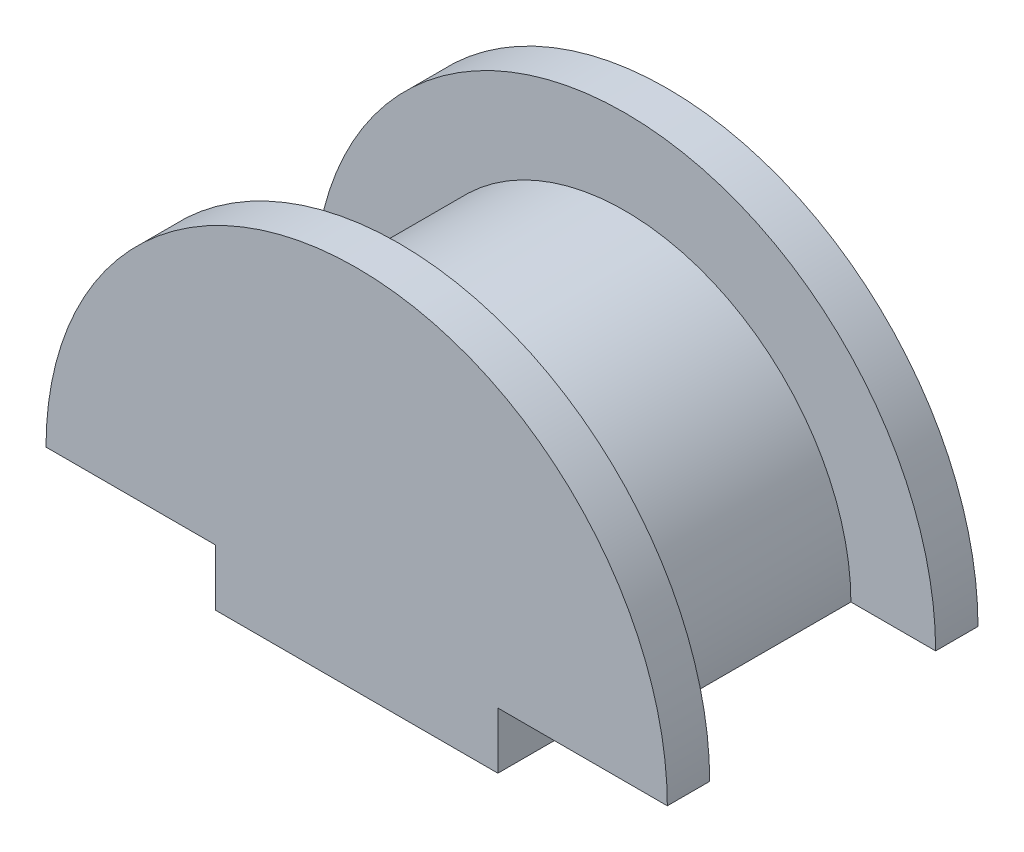
ISO-10303-21;
HEADER;
FILE_DESCRIPTION(('STEP AP214'),'2;1');
FILE_NAME('part.step','',(''),(''),'','','');
FILE_SCHEMA(('AUTOMOTIVE_DESIGN { 1 0 10303 214 1 1 1 1 }'));
ENDSEC;
DATA;
#1=APPLICATION_CONTEXT('core data for automotive mechanical design processes');
#2=APPLICATION_PROTOCOL_DEFINITION('international standard','automotive_design',2000,#1);
#3=PRODUCT_CONTEXT('',#1,'mechanical');
#4=PRODUCT('Part','Part','',(#3));
#5=PRODUCT_RELATED_PRODUCT_CATEGORY('part','',(#4));
#6=PRODUCT_DEFINITION_FORMATION('','',#4);
#7=PRODUCT_DEFINITION_CONTEXT('part definition',#1,'design');
#8=PRODUCT_DEFINITION('design','',#6,#7);
#9=PRODUCT_DEFINITION_SHAPE('','',#8);
#10=(LENGTH_UNIT() NAMED_UNIT(*) SI_UNIT(.MILLI.,.METRE.));
#11=(NAMED_UNIT(*) PLANE_ANGLE_UNIT() SI_UNIT($,.RADIAN.));
#12=(NAMED_UNIT(*) SI_UNIT($,.STERADIAN.) SOLID_ANGLE_UNIT());
#13=UNCERTAINTY_MEASURE_WITH_UNIT(LENGTH_MEASURE(1.E-05),#10,'distance_accuracy_value','');
#14=(GEOMETRIC_REPRESENTATION_CONTEXT(3) GLOBAL_UNCERTAINTY_ASSIGNED_CONTEXT((#13)) GLOBAL_UNIT_ASSIGNED_CONTEXT((#10,
#11,#12)) REPRESENTATION_CONTEXT('',''));
#15=CARTESIAN_POINT('',(0.,0.,0.));
#16=DIRECTION('',(0.,0.,1.));
#17=DIRECTION('',(1.,0.,0.));
#18=AXIS2_PLACEMENT_3D('',#15,#16,#17);
#19=CARTESIAN_POINT('',(0.,-2.,4.));
#20=DIRECTION('',(0.,-1.,0.));
#21=DIRECTION('',(0.,0.,-1.));
#22=AXIS2_PLACEMENT_3D('',#19,#20,#21);
#23=PLANE('',#22);
#24=CARTESIAN_POINT('',(0.,-2.,0.));
#25=DIRECTION('',(0.,-1.,0.));
#26=DIRECTION('',(0.,0.,-1.));
#27=AXIS2_PLACEMENT_3D('',#24,#25,#26);
#28=CIRCLE('',#27,3.);
#29=CARTESIAN_POINT('',(0.,-2.,-3.));
#30=VERTEX_POINT('',#29);
#31=EDGE_CURVE('E207',#30,#30,#28,.T.);
#32=ORIENTED_EDGE('',*,*,#31,.F.);
#33=EDGE_LOOP('',(#32));
#34=FACE_BOUND('',#33,.T.);
#35=DIRECTION('',(0.,0.,-1.));
#36=VECTOR('',#35,1.);
#37=CARTESIAN_POINT('',(-5.,-2.,4.));
#38=LINE('',#37,#36);
#39=CARTESIAN_POINT('',(-5.,-2.,5.5));
#40=VERTEX_POINT('',#39);
#41=CARTESIAN_POINT('',(-5.,-2.,-5.5));
#42=VERTEX_POINT('',#41);
#43=EDGE_CURVE('E220',#40,#42,#38,.T.);
#44=ORIENTED_EDGE('',*,*,#43,.T.);
#45=DIRECTION('',(1.,0.,0.));
#46=VECTOR('',#45,1.);
#47=CARTESIAN_POINT('',(0.,-2.,-5.5));
#48=LINE('',#47,#46);
#49=CARTESIAN_POINT('',(5.,-2.,-5.5));
#50=VERTEX_POINT('',#49);
#51=EDGE_CURVE('E139',#42,#50,#48,.T.);
#52=ORIENTED_EDGE('',*,*,#51,.T.);
#53=DIRECTION('',(0.,0.,-1.));
#54=VECTOR('',#53,1.);
#55=CARTESIAN_POINT('',(5.,-2.,4.));
#56=LINE('',#55,#54);
#57=CARTESIAN_POINT('',(5.,-2.,5.5));
#58=VERTEX_POINT('',#57);
#59=EDGE_CURVE('E11',#58,#50,#56,.T.);
#60=ORIENTED_EDGE('',*,*,#59,.F.);
#61=DIRECTION('',(1.,0.,0.));
#62=VECTOR('',#61,1.);
#63=CARTESIAN_POINT('',(0.,-2.,5.5));
#64=LINE('',#63,#62);
#65=EDGE_CURVE('E184',#40,#58,#64,.T.);
#66=ORIENTED_EDGE('',*,*,#65,.F.);
#67=EDGE_LOOP('',(#44,#52,#60,#66));
#68=FACE_BOUND('',#67,.T.);
#69=ADVANCED_FACE('F41',(#34,#68),#23,.T.);
#70=CARTESIAN_POINT('',(5.,0.,4.));
#71=DIRECTION('',(1.,0.,0.));
#72=DIRECTION('',(0.,0.,-1.));
#73=AXIS2_PLACEMENT_3D('',#70,#71,#72);
#74=PLANE('',#73);
#75=ORIENTED_EDGE('',*,*,#59,.T.);
#76=DIRECTION('',(0.,1.,0.));
#77=VECTOR('',#76,1.);
#78=CARTESIAN_POINT('',(5.,0.,-5.5));
#79=LINE('',#78,#77);
#80=CARTESIAN_POINT('',(5.,0.,-5.5));
#81=VERTEX_POINT('',#80);
#82=EDGE_CURVE('E130',#50,#81,#79,.T.);
#83=ORIENTED_EDGE('',*,*,#82,.T.);
#84=DIRECTION('',(0.,0.,-1.));
#85=VECTOR('',#84,1.);
#86=CARTESIAN_POINT('',(5.,0.,4.));
#87=LINE('',#86,#85);
#88=CARTESIAN_POINT('',(5.,0.,5.5));
#89=VERTEX_POINT('',#88);
#90=EDGE_CURVE('E50',#89,#81,#87,.T.);
#91=ORIENTED_EDGE('',*,*,#90,.F.);
#92=DIRECTION('',(0.,1.,0.));
#93=VECTOR('',#92,1.);
#94=CARTESIAN_POINT('',(5.,0.,5.5));
#95=LINE('',#94,#93);
#96=EDGE_CURVE('E188',#58,#89,#95,.T.);
#97=ORIENTED_EDGE('',*,*,#96,.F.);
#98=EDGE_LOOP('',(#75,#83,#91,#97));
#99=FACE_BOUND('',#98,.T.);
#100=ADVANCED_FACE('F137',(#99),#74,.T.);
#101=CARTESIAN_POINT('',(0.,0.,4.));
#102=DIRECTION('',(0.,-1.,0.));
#103=DIRECTION('',(0.,0.,-1.));
#104=AXIS2_PLACEMENT_3D('',#101,#102,#103);
#105=PLANE('',#104);
#106=ORIENTED_EDGE('',*,*,#90,.T.);
#107=DIRECTION('',(1.,0.,0.));
#108=VECTOR('',#107,1.);
#109=CARTESIAN_POINT('',(0.,0.,-5.5));
#110=LINE('',#109,#108);
#111=CARTESIAN_POINT('',(11.,0.,-5.5));
#112=VERTEX_POINT('',#111);
#113=EDGE_CURVE('E116',#81,#112,#110,.T.);
#114=ORIENTED_EDGE('',*,*,#113,.T.);
#115=DIRECTION('',(0.,0.,1.));
#116=VECTOR('',#115,1.);
#117=CARTESIAN_POINT('',(11.,0.,-5.5));
#118=LINE('',#117,#116);
#119=CARTESIAN_POINT('',(11.,0.,-4.));
#120=VERTEX_POINT('',#119);
#121=EDGE_CURVE('E153',#112,#120,#118,.T.);
#122=ORIENTED_EDGE('',*,*,#121,.T.);
#123=DIRECTION('',(1.,0.,0.));
#124=VECTOR('',#123,1.);
#125=CARTESIAN_POINT('',(0.,0.,-4.));
#126=LINE('',#125,#124);
#127=CARTESIAN_POINT('',(8.,0.,-4.));
#128=VERTEX_POINT('',#127);
#129=EDGE_CURVE('E154',#128,#120,#126,.T.);
#130=ORIENTED_EDGE('',*,*,#129,.F.);
#131=DIRECTION('',(0.,0.,-1.));
#132=VECTOR('',#131,1.);
#133=CARTESIAN_POINT('',(8.,0.,4.));
#134=LINE('',#133,#132);
#135=CARTESIAN_POINT('',(8.,0.,4.));
#136=VERTEX_POINT('',#135);
#137=EDGE_CURVE('E56',#136,#128,#134,.T.);
#138=ORIENTED_EDGE('',*,*,#137,.F.);
#139=DIRECTION('',(1.,0.,0.));
#140=VECTOR('',#139,1.);
#141=CARTESIAN_POINT('',(0.,0.,4.));
#142=LINE('',#141,#140);
#143=CARTESIAN_POINT('',(11.,0.,4.));
#144=VERTEX_POINT('',#143);
#145=EDGE_CURVE('E169',#136,#144,#142,.T.);
#146=ORIENTED_EDGE('',*,*,#145,.T.);
#147=DIRECTION('',(0.,0.,-1.));
#148=VECTOR('',#147,1.);
#149=CARTESIAN_POINT('',(11.,0.,5.5));
#150=LINE('',#149,#148);
#151=CARTESIAN_POINT('',(11.,0.,5.5));
#152=VERTEX_POINT('',#151);
#153=EDGE_CURVE('E203',#152,#144,#150,.T.);
#154=ORIENTED_EDGE('',*,*,#153,.F.);
#155=DIRECTION('',(1.,0.,0.));
#156=VECTOR('',#155,1.);
#157=CARTESIAN_POINT('',(0.,0.,5.5));
#158=LINE('',#157,#156);
#159=EDGE_CURVE('E120',#89,#152,#158,.T.);
#160=ORIENTED_EDGE('',*,*,#159,.F.);
#161=EDGE_LOOP('',(#106,#114,#122,#130,#138,#146,#154,#160));
#162=FACE_BOUND('',#161,.T.);
#163=ADVANCED_FACE('F114',(#162),#105,.T.);
#164=CARTESIAN_POINT('',(0.,0.,4.));
#165=DIRECTION('',(0.,0.,-1.));
#166=DIRECTION('',(-1.,0.,0.));
#167=AXIS2_PLACEMENT_3D('',#164,#165,#166);
#168=CYLINDRICAL_SURFACE('',#167,8.);
#169=CARTESIAN_POINT('',(0.,0.,-4.));
#170=DIRECTION('',(0.,0.,1.));
#171=DIRECTION('',(1.,0.,0.));
#172=AXIS2_PLACEMENT_3D('',#169,#170,#171);
#173=CIRCLE('',#172,8.);
#174=CARTESIAN_POINT('',(-8.,0.,-4.));
#175=VERTEX_POINT('',#174);
#176=EDGE_CURVE('E212',#128,#175,#173,.T.);
#177=ORIENTED_EDGE('',*,*,#176,.T.);
#178=DIRECTION('',(0.,0.,-1.));
#179=VECTOR('',#178,1.);
#180=CARTESIAN_POINT('',(-8.,0.,4.));
#181=LINE('',#180,#179);
#182=CARTESIAN_POINT('',(-8.,-2.07446151716978E-13,4.));
#183=VERTEX_POINT('',#182);
#184=EDGE_CURVE('E229',#183,#175,#181,.T.);
#185=ORIENTED_EDGE('',*,*,#184,.F.);
#186=CARTESIAN_POINT('',(0.,0.,4.));
#187=DIRECTION('',(0.,0.,1.));
#188=DIRECTION('',(1.,0.,0.));
#189=AXIS2_PLACEMENT_3D('',#186,#187,#188);
#190=CIRCLE('',#189,8.);
#191=EDGE_CURVE('E216',#136,#183,#190,.T.);
#192=ORIENTED_EDGE('',*,*,#191,.F.);
#193=ORIENTED_EDGE('',*,*,#137,.T.);
#194=EDGE_LOOP('',(#177,#185,#192,#193));
#195=FACE_BOUND('',#194,.T.);
#196=ADVANCED_FACE('F235',(#195),#168,.T.);
#197=CARTESIAN_POINT('',(0.,0.,4.));
#198=DIRECTION('',(0.,-1.,0.));
#199=DIRECTION('',(0.,0.,-1.));
#200=AXIS2_PLACEMENT_3D('',#197,#198,#199);
#201=PLANE('',#200);
#202=ORIENTED_EDGE('',*,*,#184,.T.);
#203=DIRECTION('',(-1.,0.,0.));
#204=VECTOR('',#203,1.);
#205=CARTESIAN_POINT('',(0.,0.,-4.));
#206=LINE('',#205,#204);
#207=CARTESIAN_POINT('',(-11.,-2.85238458610845E-13,-4.));
#208=VERTEX_POINT('',#207);
#209=EDGE_CURVE('E157',#175,#208,#206,.T.);
#210=ORIENTED_EDGE('',*,*,#209,.T.);
#211=DIRECTION('',(0.,0.,1.));
#212=VECTOR('',#211,1.);
#213=CARTESIAN_POINT('',(-11.,-2.85238458610845E-13,-5.5));
#214=LINE('',#213,#212);
#215=CARTESIAN_POINT('',(-11.,-2.85238458610845E-13,-5.5));
#216=VERTEX_POINT('',#215);
#217=EDGE_CURVE('E165',#216,#208,#214,.T.);
#218=ORIENTED_EDGE('',*,*,#217,.F.);
#219=DIRECTION('',(-1.,0.,0.));
#220=VECTOR('',#219,1.);
#221=CARTESIAN_POINT('',(0.,0.,-5.5));
#222=LINE('',#221,#220);
#223=CARTESIAN_POINT('',(-5.,0.,-5.5));
#224=VERTEX_POINT('',#223);
#225=EDGE_CURVE('E148',#224,#216,#222,.T.);
#226=ORIENTED_EDGE('',*,*,#225,.F.);
#227=DIRECTION('',(0.,0.,-1.));
#228=VECTOR('',#227,1.);
#229=CARTESIAN_POINT('',(-5.,0.,4.));
#230=LINE('',#229,#228);
#231=CARTESIAN_POINT('',(-5.,0.,5.5));
#232=VERTEX_POINT('',#231);
#233=EDGE_CURVE('E226',#232,#224,#230,.T.);
#234=ORIENTED_EDGE('',*,*,#233,.F.);
#235=DIRECTION('',(-1.,0.,0.));
#236=VECTOR('',#235,1.);
#237=CARTESIAN_POINT('',(0.,0.,5.5));
#238=LINE('',#237,#236);
#239=CARTESIAN_POINT('',(-11.,-2.85238458610845E-13,5.5));
#240=VERTEX_POINT('',#239);
#241=EDGE_CURVE('E176',#232,#240,#238,.T.);
#242=ORIENTED_EDGE('',*,*,#241,.T.);
#243=DIRECTION('',(0.,0.,-1.));
#244=VECTOR('',#243,1.);
#245=CARTESIAN_POINT('',(-11.,-2.85238458610845E-13,5.5));
#246=LINE('',#245,#244);
#247=CARTESIAN_POINT('',(-11.,-2.85238458610845E-13,4.));
#248=VERTEX_POINT('',#247);
#249=EDGE_CURVE('E191',#240,#248,#246,.T.);
#250=ORIENTED_EDGE('',*,*,#249,.T.);
#251=DIRECTION('',(-1.,0.,0.));
#252=VECTOR('',#251,1.);
#253=CARTESIAN_POINT('',(0.,0.,4.));
#254=LINE('',#253,#252);
#255=EDGE_CURVE('E173',#183,#248,#254,.T.);
#256=ORIENTED_EDGE('',*,*,#255,.F.);
#257=EDGE_LOOP('',(#202,#210,#218,#226,#234,#242,#250,#256));
#258=FACE_BOUND('',#257,.T.);
#259=ADVANCED_FACE('F256',(#258),#201,.T.);
#260=CARTESIAN_POINT('',(-5.,0.,4.));
#261=DIRECTION('',(1.,0.,0.));
#262=DIRECTION('',(0.,0.,-1.));
#263=AXIS2_PLACEMENT_3D('',#260,#261,#262);
#264=PLANE('',#263);
#265=ORIENTED_EDGE('',*,*,#233,.T.);
#266=DIRECTION('',(0.,-1.,0.));
#267=VECTOR('',#266,1.);
#268=CARTESIAN_POINT('',(-5.,0.,-5.5));
#269=LINE('',#268,#267);
#270=EDGE_CURVE('E142',#224,#42,#269,.T.);
#271=ORIENTED_EDGE('',*,*,#270,.T.);
#272=ORIENTED_EDGE('',*,*,#43,.F.);
#273=DIRECTION('',(0.,-1.,0.));
#274=VECTOR('',#273,1.);
#275=CARTESIAN_POINT('',(-5.,0.,5.5));
#276=LINE('',#275,#274);
#277=EDGE_CURVE('E180',#232,#40,#276,.T.);
#278=ORIENTED_EDGE('',*,*,#277,.F.);
#279=EDGE_LOOP('',(#265,#271,#272,#278));
#280=FACE_BOUND('',#279,.T.);
#281=ADVANCED_FACE('F252',(#280),#264,.F.);
#282=CARTESIAN_POINT('',(0.,4.,0.));
#283=DIRECTION('',(0.,-1.,0.));
#284=DIRECTION('',(0.,0.,-1.));
#285=AXIS2_PLACEMENT_3D('',#282,#283,#284);
#286=CYLINDRICAL_SURFACE('',#285,3.);
#287=CARTESIAN_POINT('',(0.,4.,0.));
#288=DIRECTION('',(0.,-1.,0.));
#289=DIRECTION('',(0.,0.,-1.));
#290=AXIS2_PLACEMENT_3D('',#287,#288,#289);
#291=CIRCLE('',#290,3.);
#292=CARTESIAN_POINT('',(0.,4.,-3.));
#293=VERTEX_POINT('',#292);
#294=EDGE_CURVE('E208',#293,#293,#291,.T.);
#295=ORIENTED_EDGE('',*,*,#294,.F.);
#296=EDGE_LOOP('',(#295));
#297=FACE_BOUND('',#296,.T.);
#298=ORIENTED_EDGE('',*,*,#31,.T.);
#299=EDGE_LOOP('',(#298));
#300=FACE_BOUND('',#299,.T.);
#301=ADVANCED_FACE('F276',(#297,#300),#286,.F.);
#302=CARTESIAN_POINT('',(0.,4.,0.));
#303=DIRECTION('',(0.,-1.,0.));
#304=DIRECTION('',(0.,0.,-1.));
#305=AXIS2_PLACEMENT_3D('',#302,#303,#304);
#306=PLANE('',#305);
#307=ORIENTED_EDGE('',*,*,#294,.T.);
#308=EDGE_LOOP('',(#307));
#309=FACE_BOUND('',#308,.T.);
#310=ADVANCED_FACE('F278',(#309),#306,.T.);
#311=CARTESIAN_POINT('',(0.,0.,5.5));
#312=DIRECTION('',(0.,0.,-1.));
#313=DIRECTION('',(-1.,0.,0.));
#314=AXIS2_PLACEMENT_3D('',#311,#312,#313);
#315=CYLINDRICAL_SURFACE('',#314,11.);
#316=CARTESIAN_POINT('',(0.,0.,4.));
#317=DIRECTION('',(0.,0.,1.));
#318=DIRECTION('',(1.,0.,0.));
#319=AXIS2_PLACEMENT_3D('',#316,#317,#318);
#320=CIRCLE('',#319,11.);
#321=EDGE_CURVE('E194',#144,#248,#320,.T.);
#322=ORIENTED_EDGE('',*,*,#321,.T.);
#323=ORIENTED_EDGE('',*,*,#249,.F.);
#324=CARTESIAN_POINT('',(0.,0.,5.5));
#325=DIRECTION('',(0.,0.,1.));
#326=DIRECTION('',(1.,0.,0.));
#327=AXIS2_PLACEMENT_3D('',#324,#325,#326);
#328=CIRCLE('',#327,11.);
#329=EDGE_CURVE('E172',#152,#240,#328,.T.);
#330=ORIENTED_EDGE('',*,*,#329,.F.);
#331=ORIENTED_EDGE('',*,*,#153,.T.);
#332=EDGE_LOOP('',(#322,#323,#330,#331));
#333=FACE_BOUND('',#332,.T.);
#334=ADVANCED_FACE('F242',(#333),#315,.T.);
#335=CARTESIAN_POINT('',(0.,0.,5.5));
#336=DIRECTION('',(0.,0.,1.));
#337=DIRECTION('',(1.,0.,0.));
#338=AXIS2_PLACEMENT_3D('',#335,#336,#337);
#339=PLANE('',#338);
#340=ORIENTED_EDGE('',*,*,#159,.T.);
#341=ORIENTED_EDGE('',*,*,#329,.T.);
#342=ORIENTED_EDGE('',*,*,#241,.F.);
#343=ORIENTED_EDGE('',*,*,#277,.T.);
#344=ORIENTED_EDGE('',*,*,#65,.T.);
#345=ORIENTED_EDGE('',*,*,#96,.T.);
#346=EDGE_LOOP('',(#340,#341,#342,#343,#344,#345));
#347=FACE_BOUND('',#346,.T.);
#348=ADVANCED_FACE('F246',(#347),#339,.T.);
#349=CARTESIAN_POINT('',(0.,0.,4.));
#350=DIRECTION('',(0.,0.,1.));
#351=DIRECTION('',(1.,0.,0.));
#352=AXIS2_PLACEMENT_3D('',#349,#350,#351);
#353=PLANE('',#352);
#354=ORIENTED_EDGE('',*,*,#145,.F.);
#355=ORIENTED_EDGE('',*,*,#191,.T.);
#356=ORIENTED_EDGE('',*,*,#255,.T.);
#357=ORIENTED_EDGE('',*,*,#321,.F.);
#358=EDGE_LOOP('',(#354,#355,#356,#357));
#359=FACE_BOUND('',#358,.T.);
#360=ADVANCED_FACE('F240',(#359),#353,.F.);
#361=CARTESIAN_POINT('',(0.,0.,-5.5));
#362=DIRECTION('',(0.,0.,1.));
#363=DIRECTION('',(1.,0.,0.));
#364=AXIS2_PLACEMENT_3D('',#361,#362,#363);
#365=CYLINDRICAL_SURFACE('',#364,11.);
#366=CARTESIAN_POINT('',(0.,0.,-4.));
#367=DIRECTION('',(0.,0.,1.));
#368=DIRECTION('',(1.,0.,0.));
#369=AXIS2_PLACEMENT_3D('',#366,#367,#368);
#370=CIRCLE('',#369,11.);
#371=EDGE_CURVE('E135',#120,#208,#370,.T.);
#372=ORIENTED_EDGE('',*,*,#371,.F.);
#373=ORIENTED_EDGE('',*,*,#121,.F.);
#374=CARTESIAN_POINT('',(0.,0.,-5.5));
#375=DIRECTION('',(0.,0.,1.));
#376=DIRECTION('',(1.,0.,0.));
#377=AXIS2_PLACEMENT_3D('',#374,#375,#376);
#378=CIRCLE('',#377,11.);
#379=EDGE_CURVE('E133',#112,#216,#378,.T.);
#380=ORIENTED_EDGE('',*,*,#379,.T.);
#381=ORIENTED_EDGE('',*,*,#217,.T.);
#382=EDGE_LOOP('',(#372,#373,#380,#381));
#383=FACE_BOUND('',#382,.T.);
#384=ADVANCED_FACE('F259',(#383),#365,.T.);
#385=CARTESIAN_POINT('',(0.,0.,-5.5));
#386=DIRECTION('',(0.,0.,-1.));
#387=DIRECTION('',(1.,0.,0.));
#388=AXIS2_PLACEMENT_3D('',#385,#386,#387);
#389=PLANE('',#388);
#390=ORIENTED_EDGE('',*,*,#113,.F.);
#391=ORIENTED_EDGE('',*,*,#82,.F.);
#392=ORIENTED_EDGE('',*,*,#51,.F.);
#393=ORIENTED_EDGE('',*,*,#270,.F.);
#394=ORIENTED_EDGE('',*,*,#225,.T.);
#395=ORIENTED_EDGE('',*,*,#379,.F.);
#396=EDGE_LOOP('',(#390,#391,#392,#393,#394,#395));
#397=FACE_BOUND('',#396,.T.);
#398=ADVANCED_FACE('F128',(#397),#389,.T.);
#399=CARTESIAN_POINT('',(0.,0.,-4.));
#400=DIRECTION('',(0.,0.,-1.));
#401=DIRECTION('',(1.,0.,0.));
#402=AXIS2_PLACEMENT_3D('',#399,#400,#401);
#403=PLANE('',#402);
#404=ORIENTED_EDGE('',*,*,#176,.F.);
#405=ORIENTED_EDGE('',*,*,#129,.T.);
#406=ORIENTED_EDGE('',*,*,#371,.T.);
#407=ORIENTED_EDGE('',*,*,#209,.F.);
#408=EDGE_LOOP('',(#404,#405,#406,#407));
#409=FACE_BOUND('',#408,.T.);
#410=ADVANCED_FACE('F261',(#409),#403,.F.);
#411=CLOSED_SHELL('',(#69,#100,#163,#196,#259,#281,#301,#310,#334,#348,#360,#384,#398,#410));
#412=MANIFOLD_SOLID_BREP('B2',#411);
#413=ADVANCED_BREP_SHAPE_REPRESENTATION('',(#18,#412),#14);
#414=SHAPE_DEFINITION_REPRESENTATION(#9,#413);
ENDSEC;
END-ISO-10303-21;
